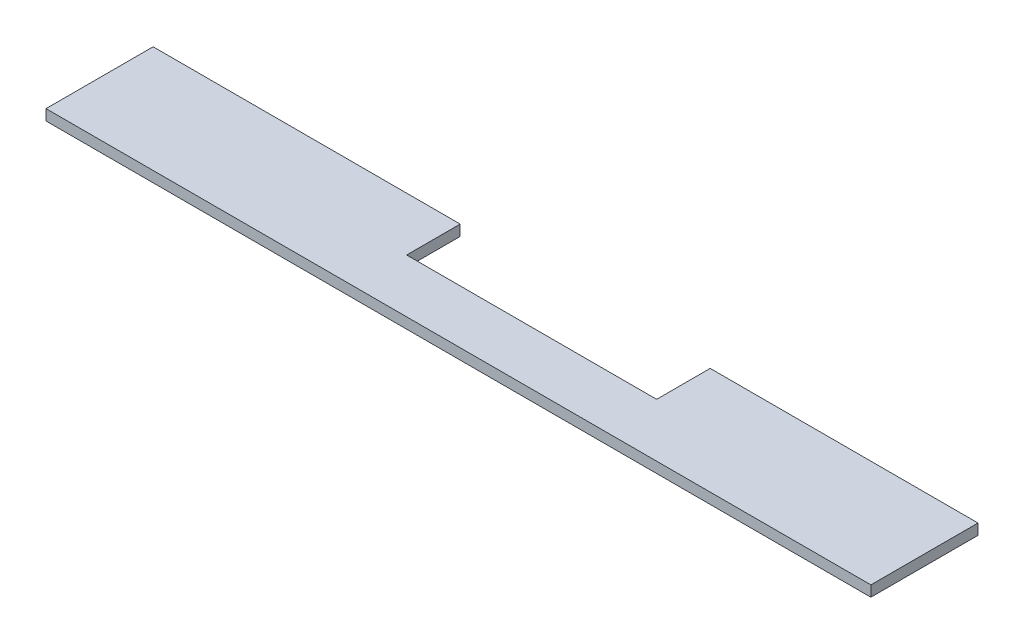
ISO-10303-21;
HEADER;
FILE_DESCRIPTION(('STEP AP214'),'2;1');
FILE_NAME('part.step','',(''),(''),'','','');
FILE_SCHEMA(('AUTOMOTIVE_DESIGN { 1 0 10303 214 1 1 1 1 }'));
ENDSEC;
DATA;
#1=APPLICATION_CONTEXT('core data for automotive mechanical design processes');
#2=APPLICATION_PROTOCOL_DEFINITION('international standard','automotive_design',2000,#1);
#3=PRODUCT_CONTEXT('',#1,'mechanical');
#4=PRODUCT('Part','Part','',(#3));
#5=PRODUCT_RELATED_PRODUCT_CATEGORY('part','',(#4));
#6=PRODUCT_DEFINITION_FORMATION('','',#4);
#7=PRODUCT_DEFINITION_CONTEXT('part definition',#1,'design');
#8=PRODUCT_DEFINITION('design','',#6,#7);
#9=PRODUCT_DEFINITION_SHAPE('','',#8);
#10=(LENGTH_UNIT() NAMED_UNIT(*) SI_UNIT(.MILLI.,.METRE.));
#11=(NAMED_UNIT(*) PLANE_ANGLE_UNIT() SI_UNIT($,.RADIAN.));
#12=(NAMED_UNIT(*) SI_UNIT($,.STERADIAN.) SOLID_ANGLE_UNIT());
#13=UNCERTAINTY_MEASURE_WITH_UNIT(LENGTH_MEASURE(1.E-05),#10,'distance_accuracy_value','');
#14=(GEOMETRIC_REPRESENTATION_CONTEXT(3) GLOBAL_UNCERTAINTY_ASSIGNED_CONTEXT((#13)) GLOBAL_UNIT_ASSIGNED_CONTEXT((#10,
#11,#12)) REPRESENTATION_CONTEXT('',''));
#15=CARTESIAN_POINT('',(0.,0.,0.));
#16=DIRECTION('',(0.,0.,1.));
#17=DIRECTION('',(1.,0.,0.));
#18=AXIS2_PLACEMENT_3D('',#15,#16,#17);
#19=CARTESIAN_POINT('',(231.,3.,-30.));
#20=DIRECTION('',(0.,0.,1.));
#21=DIRECTION('',(1.,0.,0.));
#22=AXIS2_PLACEMENT_3D('',#19,#20,#21);
#23=PLANE('',#22);
#24=DIRECTION('',(-1.,0.,0.));
#25=VECTOR('',#24,1.);
#26=CARTESIAN_POINT('',(231.,3.,-30.));
#27=LINE('',#26,#25);
#28=CARTESIAN_POINT('',(86.,3.,-30.));
#29=VERTEX_POINT('',#28);
#30=CARTESIAN_POINT('',(0.,3.,-30.));
#31=VERTEX_POINT('',#30);
#32=EDGE_CURVE('E57',#29,#31,#27,.T.);
#33=ORIENTED_EDGE('',*,*,#32,.F.);
#34=DIRECTION('',(0.,1.,0.));
#35=VECTOR('',#34,1.);
#36=CARTESIAN_POINT('',(86.,0.,-30.));
#37=LINE('',#36,#35);
#38=CARTESIAN_POINT('',(86.,0.,-30.));
#39=VERTEX_POINT('',#38);
#40=EDGE_CURVE('E133',#39,#29,#37,.T.);
#41=ORIENTED_EDGE('',*,*,#40,.F.);
#42=DIRECTION('',(-1.,0.,0.));
#43=VECTOR('',#42,1.);
#44=CARTESIAN_POINT('',(231.,0.,-30.));
#45=LINE('',#44,#43);
#46=CARTESIAN_POINT('',(0.,0.,-30.));
#47=VERTEX_POINT('',#46);
#48=EDGE_CURVE('E79',#39,#47,#45,.T.);
#49=ORIENTED_EDGE('',*,*,#48,.T.);
#50=DIRECTION('',(0.,-1.,0.));
#51=VECTOR('',#50,1.);
#52=CARTESIAN_POINT('',(0.,3.,-30.));
#53=LINE('',#52,#51);
#54=EDGE_CURVE('E149',#31,#47,#53,.T.);
#55=ORIENTED_EDGE('',*,*,#54,.F.);
#56=EDGE_LOOP('',(#33,#41,#49,#55));
#57=FACE_BOUND('',#56,.T.);
#58=ADVANCED_FACE('F33',(#57),#23,.F.);
#59=CARTESIAN_POINT('',(0.,3.,-30.));
#60=DIRECTION('',(1.,0.,0.));
#61=DIRECTION('',(0.,0.,-1.));
#62=AXIS2_PLACEMENT_3D('',#59,#60,#61);
#63=PLANE('',#62);
#64=DIRECTION('',(0.,0.,1.));
#65=VECTOR('',#64,1.);
#66=CARTESIAN_POINT('',(0.,0.,-30.));
#67=LINE('',#66,#65);
#68=CARTESIAN_POINT('',(0.,0.,0.));
#69=VERTEX_POINT('',#68);
#70=EDGE_CURVE('E135',#47,#69,#67,.T.);
#71=ORIENTED_EDGE('',*,*,#70,.T.);
#72=DIRECTION('',(0.,-1.,0.));
#73=VECTOR('',#72,1.);
#74=CARTESIAN_POINT('',(0.,3.,0.));
#75=LINE('',#74,#73);
#76=CARTESIAN_POINT('',(0.,3.,0.));
#77=VERTEX_POINT('',#76);
#78=EDGE_CURVE('E11',#77,#69,#75,.T.);
#79=ORIENTED_EDGE('',*,*,#78,.F.);
#80=DIRECTION('',(0.,0.,1.));
#81=VECTOR('',#80,1.);
#82=CARTESIAN_POINT('',(0.,3.,-30.));
#83=LINE('',#82,#81);
#84=EDGE_CURVE('E140',#31,#77,#83,.T.);
#85=ORIENTED_EDGE('',*,*,#84,.F.);
#86=ORIENTED_EDGE('',*,*,#54,.T.);
#87=EDGE_LOOP('',(#71,#79,#85,#86));
#88=FACE_BOUND('',#87,.T.);
#89=ADVANCED_FACE('F35',(#88),#63,.F.);
#90=CARTESIAN_POINT('',(0.,3.,0.));
#91=DIRECTION('',(0.,0.,-1.));
#92=DIRECTION('',(-1.,0.,0.));
#93=AXIS2_PLACEMENT_3D('',#90,#91,#92);
#94=PLANE('',#93);
#95=DIRECTION('',(1.,0.,0.));
#96=VECTOR('',#95,1.);
#97=CARTESIAN_POINT('',(0.,0.,0.));
#98=LINE('',#97,#96);
#99=CARTESIAN_POINT('',(231.,0.,0.));
#100=VERTEX_POINT('',#99);
#101=EDGE_CURVE('E152',#69,#100,#98,.T.);
#102=ORIENTED_EDGE('',*,*,#101,.T.);
#103=DIRECTION('',(0.,-1.,0.));
#104=VECTOR('',#103,1.);
#105=CARTESIAN_POINT('',(231.,3.,0.));
#106=LINE('',#105,#104);
#107=CARTESIAN_POINT('',(231.,3.,0.));
#108=VERTEX_POINT('',#107);
#109=EDGE_CURVE('E41',#108,#100,#106,.T.);
#110=ORIENTED_EDGE('',*,*,#109,.F.);
#111=DIRECTION('',(1.,0.,0.));
#112=VECTOR('',#111,1.);
#113=CARTESIAN_POINT('',(0.,3.,0.));
#114=LINE('',#113,#112);
#115=EDGE_CURVE('E86',#77,#108,#114,.T.);
#116=ORIENTED_EDGE('',*,*,#115,.F.);
#117=ORIENTED_EDGE('',*,*,#78,.T.);
#118=EDGE_LOOP('',(#102,#110,#116,#117));
#119=FACE_BOUND('',#118,.T.);
#120=ADVANCED_FACE('F176',(#119),#94,.F.);
#121=CARTESIAN_POINT('',(231.,3.,0.));
#122=DIRECTION('',(-1.,0.,0.));
#123=DIRECTION('',(0.,0.,1.));
#124=AXIS2_PLACEMENT_3D('',#121,#122,#123);
#125=PLANE('',#124);
#126=DIRECTION('',(0.,0.,-1.));
#127=VECTOR('',#126,1.);
#128=CARTESIAN_POINT('',(231.,0.,0.));
#129=LINE('',#128,#127);
#130=CARTESIAN_POINT('',(231.,0.,-30.));
#131=VERTEX_POINT('',#130);
#132=EDGE_CURVE('E154',#100,#131,#129,.T.);
#133=ORIENTED_EDGE('',*,*,#132,.T.);
#134=DIRECTION('',(0.,-1.,0.));
#135=VECTOR('',#134,1.);
#136=CARTESIAN_POINT('',(231.,3.,-30.));
#137=LINE('',#136,#135);
#138=CARTESIAN_POINT('',(231.,3.,-30.));
#139=VERTEX_POINT('',#138);
#140=EDGE_CURVE('E159',#139,#131,#137,.T.);
#141=ORIENTED_EDGE('',*,*,#140,.F.);
#142=DIRECTION('',(0.,0.,-1.));
#143=VECTOR('',#142,1.);
#144=CARTESIAN_POINT('',(231.,3.,0.));
#145=LINE('',#144,#143);
#146=EDGE_CURVE('E144',#108,#139,#145,.T.);
#147=ORIENTED_EDGE('',*,*,#146,.F.);
#148=ORIENTED_EDGE('',*,*,#109,.T.);
#149=EDGE_LOOP('',(#133,#141,#147,#148));
#150=FACE_BOUND('',#149,.T.);
#151=ADVANCED_FACE('F165',(#150),#125,.F.);
#152=CARTESIAN_POINT('',(156.,0.,-30.));
#153=VERTEX_POINT('',#152);
#154=EDGE_CURVE('E142',#131,#153,#45,.T.);
#155=ORIENTED_EDGE('',*,*,#154,.T.);
#156=DIRECTION('',(0.,1.,0.));
#157=VECTOR('',#156,1.);
#158=CARTESIAN_POINT('',(156.,0.,-30.));
#159=LINE('',#158,#157);
#160=CARTESIAN_POINT('',(156.,3.,-30.));
#161=VERTEX_POINT('',#160);
#162=EDGE_CURVE('E136',#153,#161,#159,.T.);
#163=ORIENTED_EDGE('',*,*,#162,.T.);
#164=EDGE_CURVE('E146',#139,#161,#27,.T.);
#165=ORIENTED_EDGE('',*,*,#164,.F.);
#166=ORIENTED_EDGE('',*,*,#140,.T.);
#167=EDGE_LOOP('',(#155,#163,#165,#166));
#168=FACE_BOUND('',#167,.T.);
#169=ADVANCED_FACE('F169',(#168),#23,.F.);
#170=CARTESIAN_POINT('',(0.,3.,0.));
#171=DIRECTION('',(0.,1.,0.));
#172=DIRECTION('',(0.,0.,1.));
#173=AXIS2_PLACEMENT_3D('',#170,#171,#172);
#174=PLANE('',#173);
#175=DIRECTION('',(0.,0.,1.));
#176=VECTOR('',#175,1.);
#177=CARTESIAN_POINT('',(86.,3.,-30.));
#178=LINE('',#177,#176);
#179=CARTESIAN_POINT('',(86.,3.,-15.));
#180=VERTEX_POINT('',#179);
#181=EDGE_CURVE('E112',#29,#180,#178,.T.);
#182=ORIENTED_EDGE('',*,*,#181,.F.);
#183=ORIENTED_EDGE('',*,*,#32,.T.);
#184=ORIENTED_EDGE('',*,*,#84,.T.);
#185=ORIENTED_EDGE('',*,*,#115,.T.);
#186=ORIENTED_EDGE('',*,*,#146,.T.);
#187=ORIENTED_EDGE('',*,*,#164,.T.);
#188=DIRECTION('',(0.,0.,-1.));
#189=VECTOR('',#188,1.);
#190=CARTESIAN_POINT('',(156.,3.,-30.));
#191=LINE('',#190,#189);
#192=CARTESIAN_POINT('',(156.,3.,-15.));
#193=VERTEX_POINT('',#192);
#194=EDGE_CURVE('E125',#193,#161,#191,.T.);
#195=ORIENTED_EDGE('',*,*,#194,.F.);
#196=DIRECTION('',(1.,0.,0.));
#197=VECTOR('',#196,1.);
#198=CARTESIAN_POINT('',(86.,3.,-15.));
#199=LINE('',#198,#197);
#200=EDGE_CURVE('E127',#180,#193,#199,.T.);
#201=ORIENTED_EDGE('',*,*,#200,.F.);
#202=EDGE_LOOP('',(#182,#183,#184,#185,#186,#187,#195,#201));
#203=FACE_BOUND('',#202,.T.);
#204=ADVANCED_FACE('F172',(#203),#174,.T.);
#205=CARTESIAN_POINT('',(0.,0.,0.));
#206=DIRECTION('',(0.,1.,0.));
#207=DIRECTION('',(0.,0.,1.));
#208=AXIS2_PLACEMENT_3D('',#205,#206,#207);
#209=PLANE('',#208);
#210=ORIENTED_EDGE('',*,*,#48,.F.);
#211=DIRECTION('',(0.,0.,1.));
#212=VECTOR('',#211,1.);
#213=CARTESIAN_POINT('',(86.,0.,-30.));
#214=LINE('',#213,#212);
#215=CARTESIAN_POINT('',(86.,0.,-15.));
#216=VERTEX_POINT('',#215);
#217=EDGE_CURVE('E111',#39,#216,#214,.T.);
#218=ORIENTED_EDGE('',*,*,#217,.T.);
#219=DIRECTION('',(1.,0.,0.));
#220=VECTOR('',#219,1.);
#221=CARTESIAN_POINT('',(86.,0.,-15.));
#222=LINE('',#221,#220);
#223=CARTESIAN_POINT('',(156.,0.,-15.));
#224=VERTEX_POINT('',#223);
#225=EDGE_CURVE('E119',#216,#224,#222,.T.);
#226=ORIENTED_EDGE('',*,*,#225,.T.);
#227=DIRECTION('',(0.,0.,-1.));
#228=VECTOR('',#227,1.);
#229=CARTESIAN_POINT('',(156.,0.,-30.));
#230=LINE('',#229,#228);
#231=EDGE_CURVE('E48',#224,#153,#230,.T.);
#232=ORIENTED_EDGE('',*,*,#231,.T.);
#233=ORIENTED_EDGE('',*,*,#154,.F.);
#234=ORIENTED_EDGE('',*,*,#132,.F.);
#235=ORIENTED_EDGE('',*,*,#101,.F.);
#236=ORIENTED_EDGE('',*,*,#70,.F.);
#237=EDGE_LOOP('',(#210,#218,#226,#232,#233,#234,#235,#236));
#238=FACE_BOUND('',#237,.T.);
#239=ADVANCED_FACE('F123',(#238),#209,.F.);
#240=CARTESIAN_POINT('',(86.,0.,-30.));
#241=DIRECTION('',(-1.,0.,0.));
#242=DIRECTION('',(0.,0.,1.));
#243=AXIS2_PLACEMENT_3D('',#240,#241,#242);
#244=PLANE('',#243);
#245=ORIENTED_EDGE('',*,*,#181,.T.);
#246=DIRECTION('',(0.,1.,0.));
#247=VECTOR('',#246,1.);
#248=CARTESIAN_POINT('',(86.,0.,-15.));
#249=LINE('',#248,#247);
#250=EDGE_CURVE('E107',#216,#180,#249,.T.);
#251=ORIENTED_EDGE('',*,*,#250,.F.);
#252=ORIENTED_EDGE('',*,*,#217,.F.);
#253=ORIENTED_EDGE('',*,*,#40,.T.);
#254=EDGE_LOOP('',(#245,#251,#252,#253));
#255=FACE_BOUND('',#254,.T.);
#256=ADVANCED_FACE('F109',(#255),#244,.F.);
#257=CARTESIAN_POINT('',(156.,0.,-30.));
#258=DIRECTION('',(1.,0.,0.));
#259=DIRECTION('',(0.,0.,-1.));
#260=AXIS2_PLACEMENT_3D('',#257,#258,#259);
#261=PLANE('',#260);
#262=ORIENTED_EDGE('',*,*,#194,.T.);
#263=ORIENTED_EDGE('',*,*,#162,.F.);
#264=ORIENTED_EDGE('',*,*,#231,.F.);
#265=DIRECTION('',(0.,1.,0.));
#266=VECTOR('',#265,1.);
#267=CARTESIAN_POINT('',(156.,0.,-15.));
#268=LINE('',#267,#266);
#269=EDGE_CURVE('E116',#224,#193,#268,.T.);
#270=ORIENTED_EDGE('',*,*,#269,.T.);
#271=EDGE_LOOP('',(#262,#263,#264,#270));
#272=FACE_BOUND('',#271,.T.);
#273=ADVANCED_FACE('F200',(#272),#261,.F.);
#274=CARTESIAN_POINT('',(86.,0.,-15.));
#275=DIRECTION('',(0.,0.,1.));
#276=DIRECTION('',(1.,0.,0.));
#277=AXIS2_PLACEMENT_3D('',#274,#275,#276);
#278=PLANE('',#277);
#279=ORIENTED_EDGE('',*,*,#200,.T.);
#280=ORIENTED_EDGE('',*,*,#269,.F.);
#281=ORIENTED_EDGE('',*,*,#225,.F.);
#282=ORIENTED_EDGE('',*,*,#250,.T.);
#283=EDGE_LOOP('',(#279,#280,#281,#282));
#284=FACE_BOUND('',#283,.T.);
#285=ADVANCED_FACE('F120',(#284),#278,.F.);
#286=CLOSED_SHELL('',(#58,#89,#120,#151,#169,#204,#239,#256,#273,#285));
#287=MANIFOLD_SOLID_BREP('B2',#286);
#288=ADVANCED_BREP_SHAPE_REPRESENTATION('',(#18,#287),#14);
#289=SHAPE_DEFINITION_REPRESENTATION(#9,#288);
ENDSEC;
END-ISO-10303-21;
